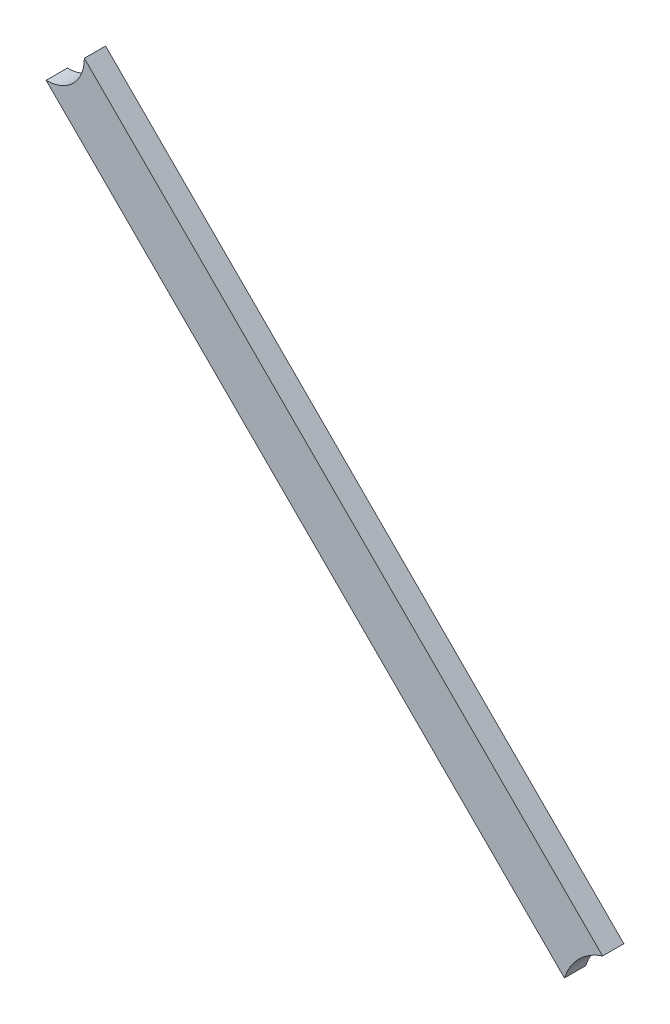
ISO-10303-21;
HEADER;
FILE_DESCRIPTION(('STEP AP214'),'2;1');
FILE_NAME('part.step','',(''),(''),'','','');
FILE_SCHEMA(('AUTOMOTIVE_DESIGN { 1 0 10303 214 1 1 1 1 }'));
ENDSEC;
DATA;
#1=APPLICATION_CONTEXT('core data for automotive mechanical design processes');
#2=APPLICATION_PROTOCOL_DEFINITION('international standard','automotive_design',2000,#1);
#3=PRODUCT_CONTEXT('',#1,'mechanical');
#4=PRODUCT('Part','Part','',(#3));
#5=PRODUCT_RELATED_PRODUCT_CATEGORY('part','',(#4));
#6=PRODUCT_DEFINITION_FORMATION('','',#4);
#7=PRODUCT_DEFINITION_CONTEXT('part definition',#1,'design');
#8=PRODUCT_DEFINITION('design','',#6,#7);
#9=PRODUCT_DEFINITION_SHAPE('','',#8);
#10=(LENGTH_UNIT() NAMED_UNIT(*) SI_UNIT(.MILLI.,.METRE.));
#11=(NAMED_UNIT(*) PLANE_ANGLE_UNIT() SI_UNIT($,.RADIAN.));
#12=(NAMED_UNIT(*) SI_UNIT($,.STERADIAN.) SOLID_ANGLE_UNIT());
#13=UNCERTAINTY_MEASURE_WITH_UNIT(LENGTH_MEASURE(1.E-05),#10,'distance_accuracy_value','');
#14=(GEOMETRIC_REPRESENTATION_CONTEXT(3) GLOBAL_UNCERTAINTY_ASSIGNED_CONTEXT((#13)) GLOBAL_UNIT_ASSIGNED_CONTEXT((#10,
#11,#12)) REPRESENTATION_CONTEXT('',''));
#15=CARTESIAN_POINT('',(0.,0.,0.));
#16=DIRECTION('',(0.,0.,1.));
#17=DIRECTION('',(1.,0.,0.));
#18=AXIS2_PLACEMENT_3D('',#15,#16,#17);
#19=CARTESIAN_POINT('',(123.618169587607,111.346354132393,0.));
#20=DIRECTION('',(0.707106781186548,0.707106781186548,0.));
#21=DIRECTION('',(0.707106781186548,-0.707106781186548,0.));
#22=AXIS2_PLACEMENT_3D('',#19,#20,#21);
#23=PLANE('',#22);
#24=DIRECTION('',(0.707106781186548,-0.707106781186548,0.));
#25=VECTOR('',#24,1.);
#26=CARTESIAN_POINT('',(123.44219406,111.52232966,0.1999996));
#27=LINE('',#26,#25);
#28=CARTESIAN_POINT('',(123.618169587607,111.346354132393,0.1999996));
#29=VERTEX_POINT('',#28);
#30=CARTESIAN_POINT('',(128.496196578856,106.468327141144,0.1999996));
#31=VERTEX_POINT('',#30);
#32=EDGE_CURVE('E11',#29,#31,#27,.T.);
#33=ORIENTED_EDGE('',*,*,#32,.F.);
#34=DIRECTION('',(0.,0.,1.));
#35=VECTOR('',#34,1.);
#36=CARTESIAN_POINT('',(123.618169587607,111.346354132393,0.));
#37=LINE('',#36,#35);
#38=CARTESIAN_POINT('',(123.618169587607,111.346354132393,0.));
#39=VERTEX_POINT('',#38);
#40=EDGE_CURVE('E24',#39,#29,#37,.T.);
#41=ORIENTED_EDGE('',*,*,#40,.F.);
#42=DIRECTION('',(0.707106781186548,-0.707106781186548,0.));
#43=VECTOR('',#42,1.);
#44=CARTESIAN_POINT('',(123.44219406,111.52232966,0.));
#45=LINE('',#44,#43);
#46=CARTESIAN_POINT('',(128.496196578856,106.468327141144,0.));
#47=VERTEX_POINT('',#46);
#48=EDGE_CURVE('E82',#39,#47,#45,.T.);
#49=ORIENTED_EDGE('',*,*,#48,.T.);
#50=DIRECTION('',(0.,0.,1.));
#51=VECTOR('',#50,1.);
#52=CARTESIAN_POINT('',(128.496196578856,106.468327141144,0.));
#53=LINE('',#52,#51);
#54=EDGE_CURVE('E37',#47,#31,#53,.T.);
#55=ORIENTED_EDGE('',*,*,#54,.T.);
#56=EDGE_LOOP('',(#33,#41,#49,#55));
#57=FACE_BOUND('',#56,.T.);
#58=ADVANCED_FACE('F17',(#57),#23,.F.);
#59=CARTESIAN_POINT('',(129.0247356,106.299,0.));
#60=DIRECTION('',(0.,0.,-1.));
#61=DIRECTION('',(1.,0.,0.));
#62=AXIS2_PLACEMENT_3D('',#59,#60,#61);
#63=CYLINDRICAL_SURFACE('',#62,0.55500016);
#64=DIRECTION('',(0.,0.,1.));
#65=VECTOR('',#64,1.);
#66=CARTESIAN_POINT('',(128.855408458856,106.827539021144,0.));
#67=LINE('',#66,#65);
#68=CARTESIAN_POINT('',(128.855408458856,106.827539021144,0.));
#69=VERTEX_POINT('',#68);
#70=CARTESIAN_POINT('',(128.855408458856,106.827539021144,0.1999996));
#71=VERTEX_POINT('',#70);
#72=EDGE_CURVE('E97',#69,#71,#67,.T.);
#73=ORIENTED_EDGE('',*,*,#72,.T.);
#74=CARTESIAN_POINT('',(129.0247356,106.299,0.1999996));
#75=DIRECTION('',(0.,0.,1.));
#76=DIRECTION('',(1.,0.,0.));
#77=AXIS2_PLACEMENT_3D('',#74,#75,#76);
#78=CIRCLE('',#77,0.55500016);
#79=EDGE_CURVE('E94',#71,#31,#78,.T.);
#80=ORIENTED_EDGE('',*,*,#79,.T.);
#81=ORIENTED_EDGE('',*,*,#54,.F.);
#82=CARTESIAN_POINT('',(129.0247356,106.299,0.));
#83=DIRECTION('',(0.,0.,1.));
#84=DIRECTION('',(1.,0.,0.));
#85=AXIS2_PLACEMENT_3D('',#82,#83,#84);
#86=CIRCLE('',#85,0.55500016);
#87=EDGE_CURVE('E92',#69,#47,#86,.T.);
#88=ORIENTED_EDGE('',*,*,#87,.F.);
#89=EDGE_LOOP('',(#73,#80,#81,#88));
#90=FACE_BOUND('',#89,.T.);
#91=ADVANCED_FACE('F102',(#90),#63,.F.);
#92=CARTESIAN_POINT('',(128.855408458856,106.827539021144,0.));
#93=DIRECTION('',(-0.707106781186548,-0.707106781186548,0.));
#94=DIRECTION('',(-0.707106781186548,0.707106781186548,0.));
#95=AXIS2_PLACEMENT_3D('',#92,#93,#94);
#96=PLANE('',#95);
#97=DIRECTION('',(-0.707106781186548,0.707106781186548,0.));
#98=VECTOR('',#97,1.);
#99=CARTESIAN_POINT('',(129.20434154,106.47860594,0.1999996));
#100=LINE('',#99,#98);
#101=CARTESIAN_POINT('',(123.977381467607,111.705566012393,0.1999996));
#102=VERTEX_POINT('',#101);
#103=EDGE_CURVE('E89',#71,#102,#100,.T.);
#104=ORIENTED_EDGE('',*,*,#103,.F.);
#105=ORIENTED_EDGE('',*,*,#72,.F.);
#106=DIRECTION('',(-0.707106781186548,0.707106781186548,0.));
#107=VECTOR('',#106,1.);
#108=CARTESIAN_POINT('',(129.20434154,106.47860594,0.));
#109=LINE('',#108,#107);
#110=CARTESIAN_POINT('',(123.977381467607,111.705566012393,0.));
#111=VERTEX_POINT('',#110);
#112=EDGE_CURVE('E87',#69,#111,#109,.T.);
#113=ORIENTED_EDGE('',*,*,#112,.T.);
#114=DIRECTION('',(0.,0.,1.));
#115=VECTOR('',#114,1.);
#116=CARTESIAN_POINT('',(123.977381467607,111.705566012393,0.));
#117=LINE('',#116,#115);
#118=EDGE_CURVE('E69',#111,#102,#117,.T.);
#119=ORIENTED_EDGE('',*,*,#118,.T.);
#120=EDGE_LOOP('',(#104,#105,#113,#119));
#121=FACE_BOUND('',#120,.T.);
#122=ADVANCED_FACE('F108',(#121),#96,.F.);
#123=CARTESIAN_POINT('',(123.6218,111.7019356,0.));
#124=DIRECTION('',(0.,0.,-1.));
#125=DIRECTION('',(1.,0.,0.));
#126=AXIS2_PLACEMENT_3D('',#123,#124,#125);
#127=CYLINDRICAL_SURFACE('',#126,0.3556);
#128=DIRECTION('',(0.,0.,1.));
#129=VECTOR('',#128,1.);
#130=CARTESIAN_POINT('',(123.9774,111.7019356,0.));
#131=LINE('',#130,#129);
#132=CARTESIAN_POINT('',(123.9774,111.7019356,0.));
#133=VERTEX_POINT('',#132);
#134=CARTESIAN_POINT('',(123.9774,111.7019356,0.1999996));
#135=VERTEX_POINT('',#134);
#136=EDGE_CURVE('E59',#133,#135,#131,.T.);
#137=ORIENTED_EDGE('',*,*,#136,.T.);
#138=CARTESIAN_POINT('',(123.6218,111.7019356,0.1999996));
#139=DIRECTION('',(0.,0.,1.));
#140=DIRECTION('',(1.,0.,0.));
#141=AXIS2_PLACEMENT_3D('',#138,#139,#140);
#142=CIRCLE('',#141,0.3556);
#143=EDGE_CURVE('E70',#135,#102,#142,.T.);
#144=ORIENTED_EDGE('',*,*,#143,.T.);
#145=ORIENTED_EDGE('',*,*,#118,.F.);
#146=CARTESIAN_POINT('',(123.6218,111.7019356,0.));
#147=DIRECTION('',(0.,0.,1.));
#148=DIRECTION('',(1.,0.,0.));
#149=AXIS2_PLACEMENT_3D('',#146,#147,#148);
#150=CIRCLE('',#149,0.3556);
#151=EDGE_CURVE('E73',#133,#111,#150,.T.);
#152=ORIENTED_EDGE('',*,*,#151,.F.);
#153=EDGE_LOOP('',(#137,#144,#145,#152));
#154=FACE_BOUND('',#153,.T.);
#155=ADVANCED_FACE('F74',(#154),#127,.F.);
#156=CARTESIAN_POINT('',(123.6218,111.7019356,0.));
#157=DIRECTION('',(0.,0.,-1.));
#158=DIRECTION('',(1.,0.,0.));
#159=AXIS2_PLACEMENT_3D('',#156,#157,#158);
#160=CYLINDRICAL_SURFACE('',#159,0.3556);
#161=ORIENTED_EDGE('',*,*,#40,.T.);
#162=CARTESIAN_POINT('',(123.6218,111.7019356,0.1999996));
#163=DIRECTION('',(0.,0.,1.));
#164=DIRECTION('',(1.,0.,0.));
#165=AXIS2_PLACEMENT_3D('',#162,#163,#164);
#166=CIRCLE('',#165,0.3556);
#167=EDGE_CURVE('E65',#29,#135,#166,.T.);
#168=ORIENTED_EDGE('',*,*,#167,.T.);
#169=ORIENTED_EDGE('',*,*,#136,.F.);
#170=EDGE_CURVE('E63',#39,#133,#150,.T.);
#171=ORIENTED_EDGE('',*,*,#170,.F.);
#172=EDGE_LOOP('',(#161,#168,#169,#171));
#173=FACE_BOUND('',#172,.T.);
#174=ADVANCED_FACE('F61',(#173),#160,.F.);
#175=CARTESIAN_POINT('',(123.44219406,111.52232966,0.));
#176=DIRECTION('',(0.,0.,-1.));
#177=DIRECTION('',(-1.,0.,0.));
#178=AXIS2_PLACEMENT_3D('',#175,#176,#177);
#179=PLANE('',#178);
#180=ORIENTED_EDGE('',*,*,#48,.F.);
#181=ORIENTED_EDGE('',*,*,#170,.T.);
#182=ORIENTED_EDGE('',*,*,#151,.T.);
#183=ORIENTED_EDGE('',*,*,#112,.F.);
#184=ORIENTED_EDGE('',*,*,#87,.T.);
#185=EDGE_LOOP('',(#180,#181,#182,#183,#184));
#186=FACE_BOUND('',#185,.T.);
#187=ADVANCED_FACE('F80',(#186),#179,.T.);
#188=CARTESIAN_POINT('',(123.44219406,111.52232966,0.1999996));
#189=DIRECTION('',(0.,0.,-1.));
#190=DIRECTION('',(-1.,0.,0.));
#191=AXIS2_PLACEMENT_3D('',#188,#189,#190);
#192=PLANE('',#191);
#193=ORIENTED_EDGE('',*,*,#167,.F.);
#194=ORIENTED_EDGE('',*,*,#32,.T.);
#195=ORIENTED_EDGE('',*,*,#79,.F.);
#196=ORIENTED_EDGE('',*,*,#103,.T.);
#197=ORIENTED_EDGE('',*,*,#143,.F.);
#198=EDGE_LOOP('',(#193,#194,#195,#196,#197));
#199=FACE_BOUND('',#198,.T.);
#200=ADVANCED_FACE('F106',(#199),#192,.F.);
#201=CLOSED_SHELL('',(#58,#91,#122,#155,#174,#187,#200));
#202=MANIFOLD_SOLID_BREP('B1',#201);
#203=ADVANCED_BREP_SHAPE_REPRESENTATION('',(#18,#202),#14);
#204=SHAPE_DEFINITION_REPRESENTATION(#9,#203);
ENDSEC;
END-ISO-10303-21;
